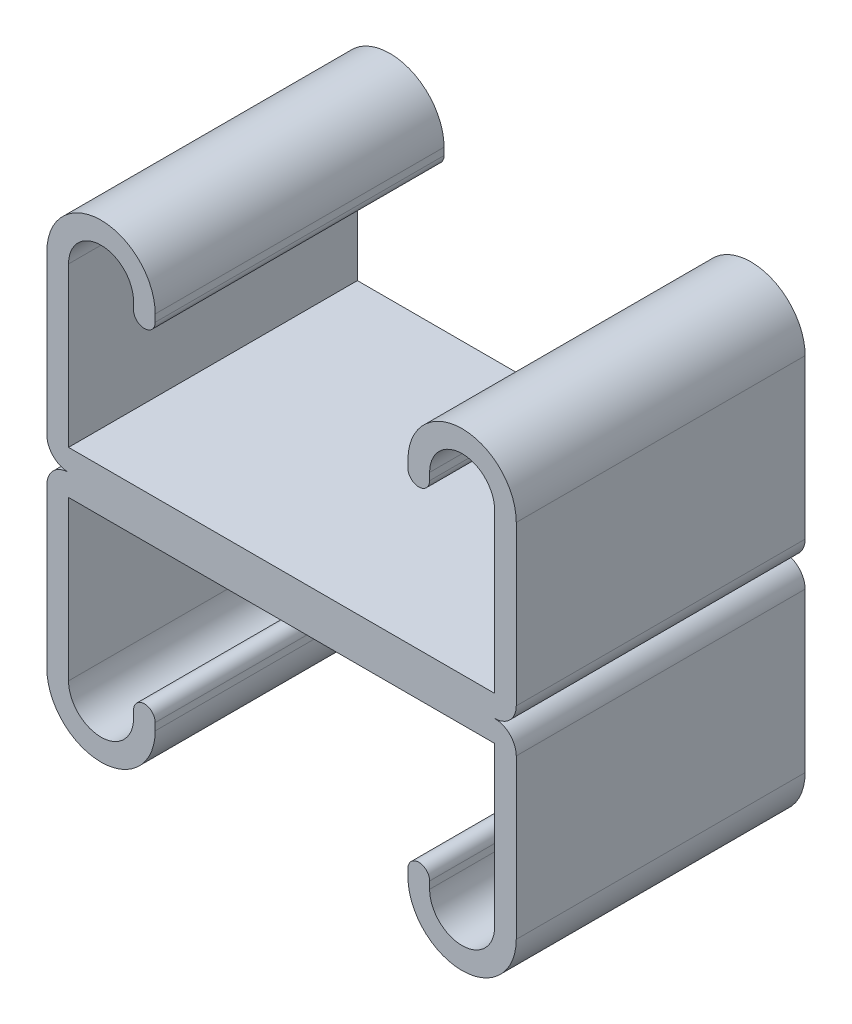
ISO-10303-21;
HEADER;
FILE_DESCRIPTION(('STEP AP214'),'2;1');
FILE_NAME('part.step','',(''),(''),'','','');
FILE_SCHEMA(('AUTOMOTIVE_DESIGN { 1 0 10303 214 1 1 1 1 }'));
ENDSEC;
DATA;
#1=APPLICATION_CONTEXT('core data for automotive mechanical design processes');
#2=APPLICATION_PROTOCOL_DEFINITION('international standard','automotive_design',2000,#1);
#3=PRODUCT_CONTEXT('',#1,'mechanical');
#4=PRODUCT('Part','Part','',(#3));
#5=PRODUCT_RELATED_PRODUCT_CATEGORY('part','',(#4));
#6=PRODUCT_DEFINITION_FORMATION('','',#4);
#7=PRODUCT_DEFINITION_CONTEXT('part definition',#1,'design');
#8=PRODUCT_DEFINITION('design','',#6,#7);
#9=PRODUCT_DEFINITION_SHAPE('','',#8);
#10=(LENGTH_UNIT() NAMED_UNIT(*) SI_UNIT(.MILLI.,.METRE.));
#11=(NAMED_UNIT(*) PLANE_ANGLE_UNIT() SI_UNIT($,.RADIAN.));
#12=(NAMED_UNIT(*) SI_UNIT($,.STERADIAN.) SOLID_ANGLE_UNIT());
#13=UNCERTAINTY_MEASURE_WITH_UNIT(LENGTH_MEASURE(1.E-05),#10,'distance_accuracy_value','');
#14=(GEOMETRIC_REPRESENTATION_CONTEXT(3) GLOBAL_UNCERTAINTY_ASSIGNED_CONTEXT((#13)) GLOBAL_UNIT_ASSIGNED_CONTEXT((#10,
#11,#12)) REPRESENTATION_CONTEXT('',''));
#15=CARTESIAN_POINT('',(0.,0.,0.));
#16=DIRECTION('',(0.,0.,1.));
#17=DIRECTION('',(1.,0.,0.));
#18=AXIS2_PLACEMENT_3D('',#15,#16,#17);
#19=CARTESIAN_POINT('',(-15.875,15.875,12.7));
#20=DIRECTION('',(0.,0.,-1.));
#21=DIRECTION('',(-1.,0.,0.));
#22=AXIS2_PLACEMENT_3D('',#19,#20,#21);
#23=CYLINDRICAL_SURFACE('',#22,4.7625);
#24=CARTESIAN_POINT('',(-15.875,15.875,-12.7));
#25=DIRECTION('',(0.,0.,1.));
#26=DIRECTION('',(-1.,0.,0.));
#27=AXIS2_PLACEMENT_3D('',#24,#25,#26);
#28=CIRCLE('',#27,4.7625);
#29=CARTESIAN_POINT('',(-11.1125,15.875,-12.7));
#30=VERTEX_POINT('',#29);
#31=CARTESIAN_POINT('',(-20.6375,15.875,-12.7));
#32=VERTEX_POINT('',#31);
#33=EDGE_CURVE('E189',#30,#32,#28,.T.);
#34=ORIENTED_EDGE('',*,*,#33,.T.);
#35=DIRECTION('',(0.,0.,-1.));
#36=VECTOR('',#35,1.);
#37=CARTESIAN_POINT('',(-20.6375,15.875,12.7));
#38=LINE('',#37,#36);
#39=CARTESIAN_POINT('',(-20.6375,15.875,12.7));
#40=VERTEX_POINT('',#39);
#41=EDGE_CURVE('E11',#40,#32,#38,.T.);
#42=ORIENTED_EDGE('',*,*,#41,.F.);
#43=CARTESIAN_POINT('',(-15.875,15.875,12.7));
#44=DIRECTION('',(0.,0.,1.));
#45=DIRECTION('',(-1.,0.,0.));
#46=AXIS2_PLACEMENT_3D('',#43,#44,#45);
#47=CIRCLE('',#46,4.7625);
#48=CARTESIAN_POINT('',(-11.1125,15.875,12.7));
#49=VERTEX_POINT('',#48);
#50=EDGE_CURVE('E222',#49,#40,#47,.T.);
#51=ORIENTED_EDGE('',*,*,#50,.F.);
#52=DIRECTION('',(0.,0.,-1.));
#53=VECTOR('',#52,1.);
#54=CARTESIAN_POINT('',(-11.1125,15.875,12.7));
#55=LINE('',#54,#53);
#56=EDGE_CURVE('E185',#49,#30,#55,.T.);
#57=ORIENTED_EDGE('',*,*,#56,.T.);
#58=EDGE_LOOP('',(#34,#42,#51,#57));
#59=FACE_BOUND('',#58,.T.);
#60=ADVANCED_FACE('F32',(#59),#23,.T.);
#61=CARTESIAN_POINT('',(-20.6375,15.875,12.7));
#62=DIRECTION('',(1.,0.,0.));
#63=DIRECTION('',(0.,1.,0.));
#64=AXIS2_PLACEMENT_3D('',#61,#62,#63);
#65=PLANE('',#64);
#66=DIRECTION('',(0.,-1.,0.));
#67=VECTOR('',#66,1.);
#68=CARTESIAN_POINT('',(-20.6375,15.875,-12.7));
#69=LINE('',#68,#67);
#70=CARTESIAN_POINT('',(-20.6375,1.905,-12.7));
#71=VERTEX_POINT('',#70);
#72=EDGE_CURVE('E192',#32,#71,#69,.T.);
#73=ORIENTED_EDGE('',*,*,#72,.T.);
#74=DIRECTION('',(0.,0.,-1.));
#75=VECTOR('',#74,1.);
#76=CARTESIAN_POINT('',(-20.6375,1.905,12.7));
#77=LINE('',#76,#75);
#78=CARTESIAN_POINT('',(-20.6375,1.905,12.7));
#79=VERTEX_POINT('',#78);
#80=EDGE_CURVE('E40',#79,#71,#77,.T.);
#81=ORIENTED_EDGE('',*,*,#80,.F.);
#82=DIRECTION('',(0.,-1.,0.));
#83=VECTOR('',#82,1.);
#84=CARTESIAN_POINT('',(-20.6375,15.875,12.7));
#85=LINE('',#84,#83);
#86=EDGE_CURVE('E119',#40,#79,#85,.T.);
#87=ORIENTED_EDGE('',*,*,#86,.F.);
#88=ORIENTED_EDGE('',*,*,#41,.T.);
#89=EDGE_LOOP('',(#73,#81,#87,#88));
#90=FACE_BOUND('',#89,.T.);
#91=ADVANCED_FACE('F384',(#90),#65,.F.);
#92=CARTESIAN_POINT('',(-18.7325,1.905,12.7));
#93=DIRECTION('',(0.,0.,-1.));
#94=DIRECTION('',(-1.,0.,0.));
#95=AXIS2_PLACEMENT_3D('',#92,#93,#94);
#96=CYLINDRICAL_SURFACE('',#95,1.905);
#97=CARTESIAN_POINT('',(-18.7325,1.905,-12.7));
#98=DIRECTION('',(0.,0.,1.));
#99=DIRECTION('',(-1.,0.,0.));
#100=AXIS2_PLACEMENT_3D('',#97,#98,#99);
#101=CIRCLE('',#100,1.905);
#102=CARTESIAN_POINT('',(-18.7325,0.,-12.7));
#103=VERTEX_POINT('',#102);
#104=EDGE_CURVE('E195',#71,#103,#101,.T.);
#105=ORIENTED_EDGE('',*,*,#104,.T.);
#106=DIRECTION('',(0.,0.,-1.));
#107=VECTOR('',#106,1.);
#108=CARTESIAN_POINT('',(-18.7325,0.,12.7));
#109=LINE('',#108,#107);
#110=CARTESIAN_POINT('',(-18.7325,0.,12.7));
#111=VERTEX_POINT('',#110);
#112=EDGE_CURVE('E259',#111,#103,#109,.T.);
#113=ORIENTED_EDGE('',*,*,#112,.F.);
#114=CARTESIAN_POINT('',(-18.7325,1.905,12.7));
#115=DIRECTION('',(0.,0.,1.));
#116=DIRECTION('',(-1.,0.,0.));
#117=AXIS2_PLACEMENT_3D('',#114,#115,#116);
#118=CIRCLE('',#117,1.905);
#119=EDGE_CURVE('E267',#79,#111,#118,.T.);
#120=ORIENTED_EDGE('',*,*,#119,.F.);
#121=ORIENTED_EDGE('',*,*,#80,.T.);
#122=EDGE_LOOP('',(#105,#113,#120,#121));
#123=FACE_BOUND('',#122,.T.);
#124=ADVANCED_FACE('F265',(#123),#96,.T.);
#125=CARTESIAN_POINT('',(18.7325,1.90500000000001,12.7));
#126=DIRECTION('',(0.,0.,-1.));
#127=DIRECTION('',(-1.,0.,0.));
#128=AXIS2_PLACEMENT_3D('',#125,#126,#127);
#129=CYLINDRICAL_SURFACE('',#128,1.905);
#130=CARTESIAN_POINT('',(18.7325,1.90500000000001,-12.7));
#131=DIRECTION('',(0.,0.,1.));
#132=DIRECTION('',(1.,0.,0.));
#133=AXIS2_PLACEMENT_3D('',#130,#131,#132);
#134=CIRCLE('',#133,1.905);
#135=CARTESIAN_POINT('',(18.7325,0.,-12.7));
#136=VERTEX_POINT('',#135);
#137=CARTESIAN_POINT('',(20.6375,1.90500000000001,-12.7));
#138=VERTEX_POINT('',#137);
#139=EDGE_CURVE('E197',#136,#138,#134,.T.);
#140=ORIENTED_EDGE('',*,*,#139,.T.);
#141=DIRECTION('',(0.,0.,-1.));
#142=VECTOR('',#141,1.);
#143=CARTESIAN_POINT('',(20.6375,1.90500000000001,12.7));
#144=LINE('',#143,#142);
#145=CARTESIAN_POINT('',(20.6375,1.90500000000001,12.7));
#146=VERTEX_POINT('',#145);
#147=EDGE_CURVE('E253',#146,#138,#144,.T.);
#148=ORIENTED_EDGE('',*,*,#147,.F.);
#149=CARTESIAN_POINT('',(18.7325,1.90500000000001,12.7));
#150=DIRECTION('',(0.,0.,1.));
#151=DIRECTION('',(1.,0.,0.));
#152=AXIS2_PLACEMENT_3D('',#149,#150,#151);
#153=CIRCLE('',#152,1.905);
#154=CARTESIAN_POINT('',(18.7325,0.,12.7));
#155=VERTEX_POINT('',#154);
#156=EDGE_CURVE('E341',#155,#146,#153,.T.);
#157=ORIENTED_EDGE('',*,*,#156,.F.);
#158=DIRECTION('',(0.,0.,-1.));
#159=VECTOR('',#158,1.);
#160=CARTESIAN_POINT('',(18.7325,0.,12.7));
#161=LINE('',#160,#159);
#162=EDGE_CURVE('E256',#155,#136,#161,.T.);
#163=ORIENTED_EDGE('',*,*,#162,.T.);
#164=EDGE_LOOP('',(#140,#148,#157,#163));
#165=FACE_BOUND('',#164,.T.);
#166=ADVANCED_FACE('F391',(#165),#129,.T.);
#167=CARTESIAN_POINT('',(20.6375,1.90500000000001,12.7));
#168=DIRECTION('',(-1.,0.,0.));
#169=DIRECTION('',(0.,0.,1.));
#170=AXIS2_PLACEMENT_3D('',#167,#168,#169);
#171=PLANE('',#170);
#172=DIRECTION('',(0.,1.,0.));
#173=VECTOR('',#172,1.);
#174=CARTESIAN_POINT('',(20.6375,1.90500000000001,-12.7));
#175=LINE('',#174,#173);
#176=CARTESIAN_POINT('',(20.6375,15.875,-12.7));
#177=VERTEX_POINT('',#176);
#178=EDGE_CURVE('E199',#138,#177,#175,.T.);
#179=ORIENTED_EDGE('',*,*,#178,.T.);
#180=DIRECTION('',(0.,0.,-1.));
#181=VECTOR('',#180,1.);
#182=CARTESIAN_POINT('',(20.6375,15.875,12.7));
#183=LINE('',#182,#181);
#184=CARTESIAN_POINT('',(20.6375,15.875,12.7));
#185=VERTEX_POINT('',#184);
#186=EDGE_CURVE('E250',#185,#177,#183,.T.);
#187=ORIENTED_EDGE('',*,*,#186,.F.);
#188=DIRECTION('',(0.,1.,0.));
#189=VECTOR('',#188,1.);
#190=CARTESIAN_POINT('',(20.6375,1.90500000000001,12.7));
#191=LINE('',#190,#189);
#192=EDGE_CURVE('E343',#146,#185,#191,.T.);
#193=ORIENTED_EDGE('',*,*,#192,.F.);
#194=ORIENTED_EDGE('',*,*,#147,.T.);
#195=EDGE_LOOP('',(#179,#187,#193,#194));
#196=FACE_BOUND('',#195,.T.);
#197=ADVANCED_FACE('F396',(#196),#171,.F.);
#198=CARTESIAN_POINT('',(15.875,15.875,12.7));
#199=DIRECTION('',(0.,0.,-1.));
#200=DIRECTION('',(-1.,0.,0.));
#201=AXIS2_PLACEMENT_3D('',#198,#199,#200);
#202=CYLINDRICAL_SURFACE('',#201,4.7625);
#203=CARTESIAN_POINT('',(15.875,15.875,-12.7));
#204=DIRECTION('',(0.,0.,1.));
#205=DIRECTION('',(1.,0.,0.));
#206=AXIS2_PLACEMENT_3D('',#203,#204,#205);
#207=CIRCLE('',#206,4.7625);
#208=CARTESIAN_POINT('',(11.1125,15.875,-12.7));
#209=VERTEX_POINT('',#208);
#210=EDGE_CURVE('E201',#177,#209,#207,.T.);
#211=ORIENTED_EDGE('',*,*,#210,.T.);
#212=DIRECTION('',(0.,0.,-1.));
#213=VECTOR('',#212,1.);
#214=CARTESIAN_POINT('',(11.1125,15.875,12.7));
#215=LINE('',#214,#213);
#216=CARTESIAN_POINT('',(11.1125,15.875,12.7));
#217=VERTEX_POINT('',#216);
#218=EDGE_CURVE('E247',#217,#209,#215,.T.);
#219=ORIENTED_EDGE('',*,*,#218,.F.);
#220=CARTESIAN_POINT('',(15.875,15.875,12.7));
#221=DIRECTION('',(0.,0.,1.));
#222=DIRECTION('',(1.,0.,0.));
#223=AXIS2_PLACEMENT_3D('',#220,#221,#222);
#224=CIRCLE('',#223,4.7625);
#225=EDGE_CURVE('E345',#185,#217,#224,.T.);
#226=ORIENTED_EDGE('',*,*,#225,.F.);
#227=ORIENTED_EDGE('',*,*,#186,.T.);
#228=EDGE_LOOP('',(#211,#219,#226,#227));
#229=FACE_BOUND('',#228,.T.);
#230=ADVANCED_FACE('F400',(#229),#202,.T.);
#231=CARTESIAN_POINT('',(11.1125,15.875,12.7));
#232=DIRECTION('',(1.,0.,0.));
#233=DIRECTION('',(0.,1.,0.));
#234=AXIS2_PLACEMENT_3D('',#231,#232,#233);
#235=PLANE('',#234);
#236=DIRECTION('',(0.,-1.,0.));
#237=VECTOR('',#236,1.);
#238=CARTESIAN_POINT('',(11.1125,15.875,-12.7));
#239=LINE('',#238,#237);
#240=CARTESIAN_POINT('',(11.1125,15.24,-12.7));
#241=VERTEX_POINT('',#240);
#242=EDGE_CURVE('E203',#209,#241,#239,.T.);
#243=ORIENTED_EDGE('',*,*,#242,.T.);
#244=DIRECTION('',(0.,0.,-1.));
#245=VECTOR('',#244,1.);
#246=CARTESIAN_POINT('',(11.1125,15.24,12.7));
#247=LINE('',#246,#245);
#248=CARTESIAN_POINT('',(11.1125,15.24,12.7));
#249=VERTEX_POINT('',#248);
#250=EDGE_CURVE('E244',#249,#241,#247,.T.);
#251=ORIENTED_EDGE('',*,*,#250,.F.);
#252=DIRECTION('',(0.,-1.,0.));
#253=VECTOR('',#252,1.);
#254=CARTESIAN_POINT('',(11.1125,15.875,12.7));
#255=LINE('',#254,#253);
#256=EDGE_CURVE('E347',#217,#249,#255,.T.);
#257=ORIENTED_EDGE('',*,*,#256,.F.);
#258=ORIENTED_EDGE('',*,*,#218,.T.);
#259=EDGE_LOOP('',(#243,#251,#257,#258));
#260=FACE_BOUND('',#259,.T.);
#261=ADVANCED_FACE('F404',(#260),#235,.F.);
#262=CARTESIAN_POINT('',(12.065,15.24,12.7));
#263=DIRECTION('',(0.,0.,-1.));
#264=DIRECTION('',(-1.,0.,0.));
#265=AXIS2_PLACEMENT_3D('',#262,#263,#264);
#266=CYLINDRICAL_SURFACE('',#265,0.952500000000002);
#267=CARTESIAN_POINT('',(12.065,15.24,-12.7));
#268=DIRECTION('',(0.,0.,1.));
#269=DIRECTION('',(1.,0.,0.));
#270=AXIS2_PLACEMENT_3D('',#267,#268,#269);
#271=CIRCLE('',#270,0.952500000000002);
#272=CARTESIAN_POINT('',(13.0175,15.24,-12.7));
#273=VERTEX_POINT('',#272);
#274=EDGE_CURVE('E205',#241,#273,#271,.T.);
#275=ORIENTED_EDGE('',*,*,#274,.T.);
#276=DIRECTION('',(0.,0.,-1.));
#277=VECTOR('',#276,1.);
#278=CARTESIAN_POINT('',(13.0175,15.24,12.7));
#279=LINE('',#278,#277);
#280=CARTESIAN_POINT('',(13.0175,15.24,12.7));
#281=VERTEX_POINT('',#280);
#282=EDGE_CURVE('E241',#281,#273,#279,.T.);
#283=ORIENTED_EDGE('',*,*,#282,.F.);
#284=CARTESIAN_POINT('',(12.065,15.24,12.7));
#285=DIRECTION('',(0.,0.,1.));
#286=DIRECTION('',(1.,0.,0.));
#287=AXIS2_PLACEMENT_3D('',#284,#285,#286);
#288=CIRCLE('',#287,0.952500000000002);
#289=EDGE_CURVE('E349',#249,#281,#288,.T.);
#290=ORIENTED_EDGE('',*,*,#289,.F.);
#291=ORIENTED_EDGE('',*,*,#250,.T.);
#292=EDGE_LOOP('',(#275,#283,#290,#291));
#293=FACE_BOUND('',#292,.T.);
#294=ADVANCED_FACE('F408',(#293),#266,.T.);
#295=CARTESIAN_POINT('',(13.0175,15.875,12.7));
#296=DIRECTION('',(-1.,0.,0.));
#297=DIRECTION('',(0.,-1.,0.));
#298=AXIS2_PLACEMENT_3D('',#295,#296,#297);
#299=PLANE('',#298);
#300=DIRECTION('',(0.,1.,0.));
#301=VECTOR('',#300,1.);
#302=CARTESIAN_POINT('',(13.0175,15.875,-12.7));
#303=LINE('',#302,#301);
#304=CARTESIAN_POINT('',(13.0175,15.875,-12.7));
#305=VERTEX_POINT('',#304);
#306=EDGE_CURVE('E207',#273,#305,#303,.T.);
#307=ORIENTED_EDGE('',*,*,#306,.T.);
#308=DIRECTION('',(0.,0.,-1.));
#309=VECTOR('',#308,1.);
#310=CARTESIAN_POINT('',(13.0175,15.875,12.7));
#311=LINE('',#310,#309);
#312=CARTESIAN_POINT('',(13.0175,15.875,12.7));
#313=VERTEX_POINT('',#312);
#314=EDGE_CURVE('E238',#313,#305,#311,.T.);
#315=ORIENTED_EDGE('',*,*,#314,.F.);
#316=DIRECTION('',(0.,1.,0.));
#317=VECTOR('',#316,1.);
#318=CARTESIAN_POINT('',(13.0175,15.875,12.7));
#319=LINE('',#318,#317);
#320=EDGE_CURVE('E351',#281,#313,#319,.T.);
#321=ORIENTED_EDGE('',*,*,#320,.F.);
#322=ORIENTED_EDGE('',*,*,#282,.T.);
#323=EDGE_LOOP('',(#307,#315,#321,#322));
#324=FACE_BOUND('',#323,.T.);
#325=ADVANCED_FACE('F412',(#324),#299,.F.);
#326=CARTESIAN_POINT('',(15.875,15.875,12.7));
#327=DIRECTION('',(0.,0.,-1.));
#328=DIRECTION('',(-1.,0.,0.));
#329=AXIS2_PLACEMENT_3D('',#326,#327,#328);
#330=CYLINDRICAL_SURFACE('',#329,2.8575);
#331=CARTESIAN_POINT('',(15.875,15.875,-12.7));
#332=DIRECTION('',(0.,0.,-1.));
#333=DIRECTION('',(1.,0.,0.));
#334=AXIS2_PLACEMENT_3D('',#331,#332,#333);
#335=CIRCLE('',#334,2.8575);
#336=CARTESIAN_POINT('',(18.7325,15.875,-12.7));
#337=VERTEX_POINT('',#336);
#338=EDGE_CURVE('E209',#305,#337,#335,.T.);
#339=ORIENTED_EDGE('',*,*,#338,.T.);
#340=DIRECTION('',(0.,0.,-1.));
#341=VECTOR('',#340,1.);
#342=CARTESIAN_POINT('',(18.7325,15.875,12.7));
#343=LINE('',#342,#341);
#344=CARTESIAN_POINT('',(18.7325,15.875,12.7));
#345=VERTEX_POINT('',#344);
#346=EDGE_CURVE('E235',#345,#337,#343,.T.);
#347=ORIENTED_EDGE('',*,*,#346,.F.);
#348=CARTESIAN_POINT('',(15.875,15.875,12.7));
#349=DIRECTION('',(0.,0.,-1.));
#350=DIRECTION('',(1.,0.,0.));
#351=AXIS2_PLACEMENT_3D('',#348,#349,#350);
#352=CIRCLE('',#351,2.8575);
#353=EDGE_CURVE('E353',#313,#345,#352,.T.);
#354=ORIENTED_EDGE('',*,*,#353,.F.);
#355=ORIENTED_EDGE('',*,*,#314,.T.);
#356=EDGE_LOOP('',(#339,#347,#354,#355));
#357=FACE_BOUND('',#356,.T.);
#358=ADVANCED_FACE('F416',(#357),#330,.F.);
#359=CARTESIAN_POINT('',(18.7325,1.905,12.7));
#360=DIRECTION('',(1.,0.,0.));
#361=DIRECTION('',(0.,1.,0.));
#362=AXIS2_PLACEMENT_3D('',#359,#360,#361);
#363=PLANE('',#362);
#364=DIRECTION('',(0.,-1.,0.));
#365=VECTOR('',#364,1.);
#366=CARTESIAN_POINT('',(18.7325,1.905,-12.7));
#367=LINE('',#366,#365);
#368=CARTESIAN_POINT('',(18.7325,1.905,-12.7));
#369=VERTEX_POINT('',#368);
#370=EDGE_CURVE('E211',#337,#369,#367,.T.);
#371=ORIENTED_EDGE('',*,*,#370,.T.);
#372=DIRECTION('',(0.,0.,-1.));
#373=VECTOR('',#372,1.);
#374=CARTESIAN_POINT('',(18.7325,1.905,12.7));
#375=LINE('',#374,#373);
#376=CARTESIAN_POINT('',(18.7325,1.905,12.7));
#377=VERTEX_POINT('',#376);
#378=EDGE_CURVE('E232',#377,#369,#375,.T.);
#379=ORIENTED_EDGE('',*,*,#378,.F.);
#380=DIRECTION('',(0.,-1.,0.));
#381=VECTOR('',#380,1.);
#382=CARTESIAN_POINT('',(18.7325,1.905,12.7));
#383=LINE('',#382,#381);
#384=EDGE_CURVE('E355',#345,#377,#383,.T.);
#385=ORIENTED_EDGE('',*,*,#384,.F.);
#386=ORIENTED_EDGE('',*,*,#346,.T.);
#387=EDGE_LOOP('',(#371,#379,#385,#386));
#388=FACE_BOUND('',#387,.T.);
#389=ADVANCED_FACE('F420',(#388),#363,.F.);
#390=CARTESIAN_POINT('',(-18.7325,1.905,12.7));
#391=DIRECTION('',(0.,-1.,0.));
#392=DIRECTION('',(1.,0.,0.));
#393=AXIS2_PLACEMENT_3D('',#390,#391,#392);
#394=PLANE('',#393);
#395=DIRECTION('',(-1.,0.,0.));
#396=VECTOR('',#395,1.);
#397=CARTESIAN_POINT('',(-18.7325,1.905,-12.7));
#398=LINE('',#397,#396);
#399=CARTESIAN_POINT('',(-18.7325,1.905,-12.7));
#400=VERTEX_POINT('',#399);
#401=EDGE_CURVE('E213',#369,#400,#398,.T.);
#402=ORIENTED_EDGE('',*,*,#401,.T.);
#403=DIRECTION('',(0.,0.,-1.));
#404=VECTOR('',#403,1.);
#405=CARTESIAN_POINT('',(-18.7325,1.905,12.7));
#406=LINE('',#405,#404);
#407=CARTESIAN_POINT('',(-18.7325,1.905,12.7));
#408=VERTEX_POINT('',#407);
#409=EDGE_CURVE('E229',#408,#400,#406,.T.);
#410=ORIENTED_EDGE('',*,*,#409,.F.);
#411=DIRECTION('',(-1.,0.,0.));
#412=VECTOR('',#411,1.);
#413=CARTESIAN_POINT('',(-18.7325,1.905,12.7));
#414=LINE('',#413,#412);
#415=EDGE_CURVE('E357',#377,#408,#414,.T.);
#416=ORIENTED_EDGE('',*,*,#415,.F.);
#417=ORIENTED_EDGE('',*,*,#378,.T.);
#418=EDGE_LOOP('',(#402,#410,#416,#417));
#419=FACE_BOUND('',#418,.T.);
#420=ADVANCED_FACE('F424',(#419),#394,.F.);
#421=CARTESIAN_POINT('',(-18.7325,15.875,12.7));
#422=DIRECTION('',(-1.,0.,0.));
#423=DIRECTION('',(0.,-1.,0.));
#424=AXIS2_PLACEMENT_3D('',#421,#422,#423);
#425=PLANE('',#424);
#426=DIRECTION('',(0.,1.,0.));
#427=VECTOR('',#426,1.);
#428=CARTESIAN_POINT('',(-18.7325,15.875,-12.7));
#429=LINE('',#428,#427);
#430=CARTESIAN_POINT('',(-18.7325,15.875,-12.7));
#431=VERTEX_POINT('',#430);
#432=EDGE_CURVE('E215',#400,#431,#429,.T.);
#433=ORIENTED_EDGE('',*,*,#432,.T.);
#434=DIRECTION('',(0.,0.,-1.));
#435=VECTOR('',#434,1.);
#436=CARTESIAN_POINT('',(-18.7325,15.875,12.7));
#437=LINE('',#436,#435);
#438=CARTESIAN_POINT('',(-18.7325,15.875,12.7));
#439=VERTEX_POINT('',#438);
#440=EDGE_CURVE('E226',#439,#431,#437,.T.);
#441=ORIENTED_EDGE('',*,*,#440,.F.);
#442=DIRECTION('',(0.,1.,0.));
#443=VECTOR('',#442,1.);
#444=CARTESIAN_POINT('',(-18.7325,15.875,12.7));
#445=LINE('',#444,#443);
#446=EDGE_CURVE('E359',#408,#439,#445,.T.);
#447=ORIENTED_EDGE('',*,*,#446,.F.);
#448=ORIENTED_EDGE('',*,*,#409,.T.);
#449=EDGE_LOOP('',(#433,#441,#447,#448));
#450=FACE_BOUND('',#449,.T.);
#451=ADVANCED_FACE('F365',(#450),#425,.F.);
#452=CARTESIAN_POINT('',(-15.875,15.875,12.7));
#453=DIRECTION('',(0.,0.,-1.));
#454=DIRECTION('',(-1.,0.,0.));
#455=AXIS2_PLACEMENT_3D('',#452,#453,#454);
#456=CYLINDRICAL_SURFACE('',#455,2.8575);
#457=CARTESIAN_POINT('',(-15.875,15.875,-12.7));
#458=DIRECTION('',(0.,0.,-1.));
#459=DIRECTION('',(-1.,0.,0.));
#460=AXIS2_PLACEMENT_3D('',#457,#458,#459);
#461=CIRCLE('',#460,2.8575);
#462=CARTESIAN_POINT('',(-13.0175,15.875,-12.7));
#463=VERTEX_POINT('',#462);
#464=EDGE_CURVE('E217',#431,#463,#461,.T.);
#465=ORIENTED_EDGE('',*,*,#464,.T.);
#466=DIRECTION('',(0.,0.,-1.));
#467=VECTOR('',#466,1.);
#468=CARTESIAN_POINT('',(-13.0175,15.875,12.7));
#469=LINE('',#468,#467);
#470=CARTESIAN_POINT('',(-13.0175,15.875,12.7));
#471=VERTEX_POINT('',#470);
#472=EDGE_CURVE('E180',#471,#463,#469,.T.);
#473=ORIENTED_EDGE('',*,*,#472,.F.);
#474=CARTESIAN_POINT('',(-15.875,15.875,12.7));
#475=DIRECTION('',(0.,0.,-1.));
#476=DIRECTION('',(-1.,0.,0.));
#477=AXIS2_PLACEMENT_3D('',#474,#475,#476);
#478=CIRCLE('',#477,2.8575);
#479=EDGE_CURVE('E171',#439,#471,#478,.T.);
#480=ORIENTED_EDGE('',*,*,#479,.F.);
#481=ORIENTED_EDGE('',*,*,#440,.T.);
#482=EDGE_LOOP('',(#465,#473,#480,#481));
#483=FACE_BOUND('',#482,.T.);
#484=ADVANCED_FACE('F369',(#483),#456,.F.);
#485=CARTESIAN_POINT('',(-13.0175,15.875,12.7));
#486=DIRECTION('',(1.,0.,0.));
#487=DIRECTION('',(0.,1.,0.));
#488=AXIS2_PLACEMENT_3D('',#485,#486,#487);
#489=PLANE('',#488);
#490=DIRECTION('',(0.,-1.,0.));
#491=VECTOR('',#490,1.);
#492=CARTESIAN_POINT('',(-13.0175,15.875,-12.7));
#493=LINE('',#492,#491);
#494=CARTESIAN_POINT('',(-13.0175,15.24,-12.7));
#495=VERTEX_POINT('',#494);
#496=EDGE_CURVE('E179',#463,#495,#493,.T.);
#497=ORIENTED_EDGE('',*,*,#496,.T.);
#498=DIRECTION('',(0.,0.,-1.));
#499=VECTOR('',#498,1.);
#500=CARTESIAN_POINT('',(-13.0175,15.24,12.7));
#501=LINE('',#500,#499);
#502=CARTESIAN_POINT('',(-13.0175,15.24,12.7));
#503=VERTEX_POINT('',#502);
#504=EDGE_CURVE('E176',#503,#495,#501,.T.);
#505=ORIENTED_EDGE('',*,*,#504,.F.);
#506=DIRECTION('',(0.,-1.,0.));
#507=VECTOR('',#506,1.);
#508=CARTESIAN_POINT('',(-13.0175,15.875,12.7));
#509=LINE('',#508,#507);
#510=EDGE_CURVE('E165',#471,#503,#509,.T.);
#511=ORIENTED_EDGE('',*,*,#510,.F.);
#512=ORIENTED_EDGE('',*,*,#472,.T.);
#513=EDGE_LOOP('',(#497,#505,#511,#512));
#514=FACE_BOUND('',#513,.T.);
#515=ADVANCED_FACE('F177',(#514),#489,.F.);
#516=CARTESIAN_POINT('',(-12.065,15.24,12.7));
#517=DIRECTION('',(0.,0.,-1.));
#518=DIRECTION('',(-1.,0.,0.));
#519=AXIS2_PLACEMENT_3D('',#516,#517,#518);
#520=CYLINDRICAL_SURFACE('',#519,0.952500000000002);
#521=CARTESIAN_POINT('',(-12.065,15.24,-12.7));
#522=DIRECTION('',(0.,0.,1.));
#523=DIRECTION('',(-1.,0.,0.));
#524=AXIS2_PLACEMENT_3D('',#521,#522,#523);
#525=CIRCLE('',#524,0.952500000000002);
#526=CARTESIAN_POINT('',(-11.1125,15.24,-12.7));
#527=VERTEX_POINT('',#526);
#528=EDGE_CURVE('E105',#495,#527,#525,.T.);
#529=ORIENTED_EDGE('',*,*,#528,.T.);
#530=DIRECTION('',(0.,0.,-1.));
#531=VECTOR('',#530,1.);
#532=CARTESIAN_POINT('',(-11.1125,15.24,12.7));
#533=LINE('',#532,#531);
#534=CARTESIAN_POINT('',(-11.1125,15.24,12.7));
#535=VERTEX_POINT('',#534);
#536=EDGE_CURVE('E181',#535,#527,#533,.T.);
#537=ORIENTED_EDGE('',*,*,#536,.F.);
#538=CARTESIAN_POINT('',(-12.065,15.24,12.7));
#539=DIRECTION('',(0.,0.,1.));
#540=DIRECTION('',(-1.,0.,0.));
#541=AXIS2_PLACEMENT_3D('',#538,#539,#540);
#542=CIRCLE('',#541,0.952500000000002);
#543=EDGE_CURVE('E169',#503,#535,#542,.T.);
#544=ORIENTED_EDGE('',*,*,#543,.F.);
#545=ORIENTED_EDGE('',*,*,#504,.T.);
#546=EDGE_LOOP('',(#529,#537,#544,#545));
#547=FACE_BOUND('',#546,.T.);
#548=ADVANCED_FACE('F183',(#547),#520,.T.);
#549=CARTESIAN_POINT('',(-11.1125,15.875,12.7));
#550=DIRECTION('',(-1.,0.,0.));
#551=DIRECTION('',(0.,-1.,0.));
#552=AXIS2_PLACEMENT_3D('',#549,#550,#551);
#553=PLANE('',#552);
#554=DIRECTION('',(0.,1.,0.));
#555=VECTOR('',#554,1.);
#556=CARTESIAN_POINT('',(-11.1125,15.875,-12.7));
#557=LINE('',#556,#555);
#558=EDGE_CURVE('E111',#527,#30,#557,.T.);
#559=ORIENTED_EDGE('',*,*,#558,.T.);
#560=ORIENTED_EDGE('',*,*,#56,.F.);
#561=DIRECTION('',(0.,1.,0.));
#562=VECTOR('',#561,1.);
#563=CARTESIAN_POINT('',(-11.1125,15.875,12.7));
#564=LINE('',#563,#562);
#565=EDGE_CURVE('E48',#535,#49,#564,.T.);
#566=ORIENTED_EDGE('',*,*,#565,.F.);
#567=ORIENTED_EDGE('',*,*,#536,.T.);
#568=EDGE_LOOP('',(#559,#560,#566,#567));
#569=FACE_BOUND('',#568,.T.);
#570=ADVANCED_FACE('F373',(#569),#553,.F.);
#571=CARTESIAN_POINT('',(-15.875,15.875,12.7));
#572=DIRECTION('',(0.,0.,-1.));
#573=DIRECTION('',(-1.,0.,0.));
#574=AXIS2_PLACEMENT_3D('',#571,#572,#573);
#575=PLANE('',#574);
#576=ORIENTED_EDGE('',*,*,#50,.T.);
#577=ORIENTED_EDGE('',*,*,#86,.T.);
#578=ORIENTED_EDGE('',*,*,#119,.T.);
#579=CARTESIAN_POINT('',(-18.7325,-1.905,12.7));
#580=DIRECTION('',(0.,0.,-1.));
#581=DIRECTION('',(-1.,0.,0.));
#582=AXIS2_PLACEMENT_3D('',#579,#580,#581);
#583=CIRCLE('',#582,1.905);
#584=CARTESIAN_POINT('',(-20.6375,-1.905,12.7));
#585=VERTEX_POINT('',#584);
#586=EDGE_CURVE('E782',#585,#111,#583,.T.);
#587=ORIENTED_EDGE('',*,*,#586,.F.);
#588=DIRECTION('',(0.,1.,0.));
#589=VECTOR('',#588,1.);
#590=CARTESIAN_POINT('',(-20.6375,-15.875,12.7));
#591=LINE('',#590,#589);
#592=CARTESIAN_POINT('',(-20.6375,-15.875,12.7));
#593=VERTEX_POINT('',#592);
#594=EDGE_CURVE('E294',#593,#585,#591,.T.);
#595=ORIENTED_EDGE('',*,*,#594,.F.);
#596=CARTESIAN_POINT('',(-15.875,-15.875,12.7));
#597=DIRECTION('',(0.,0.,-1.));
#598=DIRECTION('',(-1.,0.,0.));
#599=AXIS2_PLACEMENT_3D('',#596,#597,#598);
#600=CIRCLE('',#599,4.7625);
#601=CARTESIAN_POINT('',(-11.1125,-15.875,12.7));
#602=VERTEX_POINT('',#601);
#603=EDGE_CURVE('E283',#602,#593,#600,.T.);
#604=ORIENTED_EDGE('',*,*,#603,.F.);
#605=DIRECTION('',(0.,-1.,0.));
#606=VECTOR('',#605,1.);
#607=CARTESIAN_POINT('',(-11.1125,-15.875,12.7));
#608=LINE('',#607,#606);
#609=CARTESIAN_POINT('',(-11.1125,-15.24,12.7));
#610=VERTEX_POINT('',#609);
#611=EDGE_CURVE('E731',#610,#602,#608,.T.);
#612=ORIENTED_EDGE('',*,*,#611,.F.);
#613=CARTESIAN_POINT('',(-12.065,-15.24,12.7));
#614=DIRECTION('',(0.,0.,-1.));
#615=DIRECTION('',(-1.,0.,0.));
#616=AXIS2_PLACEMENT_3D('',#613,#614,#615);
#617=CIRCLE('',#616,0.952500000000002);
#618=CARTESIAN_POINT('',(-13.0175,-15.24,12.7));
#619=VERTEX_POINT('',#618);
#620=EDGE_CURVE('E740',#619,#610,#617,.T.);
#621=ORIENTED_EDGE('',*,*,#620,.F.);
#622=DIRECTION('',(0.,1.,0.));
#623=VECTOR('',#622,1.);
#624=CARTESIAN_POINT('',(-13.0175,-15.875,12.7));
#625=LINE('',#624,#623);
#626=CARTESIAN_POINT('',(-13.0175,-15.875,12.7));
#627=VERTEX_POINT('',#626);
#628=EDGE_CURVE('E744',#627,#619,#625,.T.);
#629=ORIENTED_EDGE('',*,*,#628,.F.);
#630=CARTESIAN_POINT('',(-15.875,-15.875,12.7));
#631=DIRECTION('',(0.,0.,1.));
#632=DIRECTION('',(-1.,0.,0.));
#633=AXIS2_PLACEMENT_3D('',#630,#631,#632);
#634=CIRCLE('',#633,2.8575);
#635=CARTESIAN_POINT('',(-18.7325,-15.875,12.7));
#636=VERTEX_POINT('',#635);
#637=EDGE_CURVE('E746',#636,#627,#634,.T.);
#638=ORIENTED_EDGE('',*,*,#637,.F.);
#639=DIRECTION('',(0.,-1.,0.));
#640=VECTOR('',#639,1.);
#641=CARTESIAN_POINT('',(-18.7325,-15.875,12.7));
#642=LINE('',#641,#640);
#643=CARTESIAN_POINT('',(-18.7325,-1.905,12.7));
#644=VERTEX_POINT('',#643);
#645=EDGE_CURVE('E752',#644,#636,#642,.T.);
#646=ORIENTED_EDGE('',*,*,#645,.F.);
#647=DIRECTION('',(-1.,0.,0.));
#648=VECTOR('',#647,1.);
#649=CARTESIAN_POINT('',(-18.7325,-1.905,12.7));
#650=LINE('',#649,#648);
#651=CARTESIAN_POINT('',(18.7325,-1.905,12.7));
#652=VERTEX_POINT('',#651);
#653=EDGE_CURVE('E755',#652,#644,#650,.T.);
#654=ORIENTED_EDGE('',*,*,#653,.F.);
#655=DIRECTION('',(0.,1.,0.));
#656=VECTOR('',#655,1.);
#657=CARTESIAN_POINT('',(18.7325,-1.905,12.7));
#658=LINE('',#657,#656);
#659=CARTESIAN_POINT('',(18.7325,-15.875,12.7));
#660=VERTEX_POINT('',#659);
#661=EDGE_CURVE('E758',#660,#652,#658,.T.);
#662=ORIENTED_EDGE('',*,*,#661,.F.);
#663=CARTESIAN_POINT('',(15.875,-15.875,12.7));
#664=DIRECTION('',(0.,0.,1.));
#665=DIRECTION('',(1.,0.,0.));
#666=AXIS2_PLACEMENT_3D('',#663,#664,#665);
#667=CIRCLE('',#666,2.8575);
#668=CARTESIAN_POINT('',(13.0175,-15.875,12.7));
#669=VERTEX_POINT('',#668);
#670=EDGE_CURVE('E761',#669,#660,#667,.T.);
#671=ORIENTED_EDGE('',*,*,#670,.F.);
#672=DIRECTION('',(0.,-1.,0.));
#673=VECTOR('',#672,1.);
#674=CARTESIAN_POINT('',(13.0175,-15.875,12.7));
#675=LINE('',#674,#673);
#676=CARTESIAN_POINT('',(13.0175,-15.24,12.7));
#677=VERTEX_POINT('',#676);
#678=EDGE_CURVE('E764',#677,#669,#675,.T.);
#679=ORIENTED_EDGE('',*,*,#678,.F.);
#680=CARTESIAN_POINT('',(12.065,-15.24,12.7));
#681=DIRECTION('',(0.,0.,-1.));
#682=DIRECTION('',(1.,0.,0.));
#683=AXIS2_PLACEMENT_3D('',#680,#681,#682);
#684=CIRCLE('',#683,0.952500000000002);
#685=CARTESIAN_POINT('',(11.1125,-15.24,12.7));
#686=VERTEX_POINT('',#685);
#687=EDGE_CURVE('E767',#686,#677,#684,.T.);
#688=ORIENTED_EDGE('',*,*,#687,.F.);
#689=DIRECTION('',(0.,1.,0.));
#690=VECTOR('',#689,1.);
#691=CARTESIAN_POINT('',(11.1125,-15.875,12.7));
#692=LINE('',#691,#690);
#693=CARTESIAN_POINT('',(11.1125,-15.875,12.7));
#694=VERTEX_POINT('',#693);
#695=EDGE_CURVE('E770',#694,#686,#692,.T.);
#696=ORIENTED_EDGE('',*,*,#695,.F.);
#697=CARTESIAN_POINT('',(15.875,-15.875,12.7));
#698=DIRECTION('',(0.,0.,-1.));
#699=DIRECTION('',(1.,0.,0.));
#700=AXIS2_PLACEMENT_3D('',#697,#698,#699);
#701=CIRCLE('',#700,4.7625);
#702=CARTESIAN_POINT('',(20.6375,-15.875,12.7));
#703=VERTEX_POINT('',#702);
#704=EDGE_CURVE('E773',#703,#694,#701,.T.);
#705=ORIENTED_EDGE('',*,*,#704,.F.);
#706=DIRECTION('',(0.,-1.,0.));
#707=VECTOR('',#706,1.);
#708=CARTESIAN_POINT('',(20.6375,-1.90500000000001,12.7));
#709=LINE('',#708,#707);
#710=CARTESIAN_POINT('',(20.6375,-1.90500000000001,12.7));
#711=VERTEX_POINT('',#710);
#712=EDGE_CURVE('E776',#711,#703,#709,.T.);
#713=ORIENTED_EDGE('',*,*,#712,.F.);
#714=CARTESIAN_POINT('',(18.7325,-1.90500000000001,12.7));
#715=DIRECTION('',(0.,0.,-1.));
#716=DIRECTION('',(1.,0.,0.));
#717=AXIS2_PLACEMENT_3D('',#714,#715,#716);
#718=CIRCLE('',#717,1.905);
#719=EDGE_CURVE('E779',#155,#711,#718,.T.);
#720=ORIENTED_EDGE('',*,*,#719,.F.);
#721=ORIENTED_EDGE('',*,*,#156,.T.);
#722=ORIENTED_EDGE('',*,*,#192,.T.);
#723=ORIENTED_EDGE('',*,*,#225,.T.);
#724=ORIENTED_EDGE('',*,*,#256,.T.);
#725=ORIENTED_EDGE('',*,*,#289,.T.);
#726=ORIENTED_EDGE('',*,*,#320,.T.);
#727=ORIENTED_EDGE('',*,*,#353,.T.);
#728=ORIENTED_EDGE('',*,*,#384,.T.);
#729=ORIENTED_EDGE('',*,*,#415,.T.);
#730=ORIENTED_EDGE('',*,*,#446,.T.);
#731=ORIENTED_EDGE('',*,*,#479,.T.);
#732=ORIENTED_EDGE('',*,*,#510,.T.);
#733=ORIENTED_EDGE('',*,*,#543,.T.);
#734=ORIENTED_EDGE('',*,*,#565,.T.);
#735=EDGE_LOOP('',(#576,#577,#578,#587,#595,#604,#612,#621,#629,#638,#646,#654,#662,#671,#679,
#688,#696,#705,#713,#720,#721,#722,#723,#724,#725,#726,#727,#728,#729,#730,#731,#732,#733,#734));
#736=FACE_BOUND('',#735,.T.);
#737=ADVANCED_FACE('F167',(#736),#575,.F.);
#738=CARTESIAN_POINT('',(-15.875,15.875,-12.7));
#739=DIRECTION('',(0.,0.,-1.));
#740=DIRECTION('',(-1.,0.,0.));
#741=AXIS2_PLACEMENT_3D('',#738,#739,#740);
#742=PLANE('',#741);
#743=ORIENTED_EDGE('',*,*,#33,.F.);
#744=ORIENTED_EDGE('',*,*,#558,.F.);
#745=ORIENTED_EDGE('',*,*,#528,.F.);
#746=ORIENTED_EDGE('',*,*,#496,.F.);
#747=ORIENTED_EDGE('',*,*,#464,.F.);
#748=ORIENTED_EDGE('',*,*,#432,.F.);
#749=ORIENTED_EDGE('',*,*,#401,.F.);
#750=ORIENTED_EDGE('',*,*,#370,.F.);
#751=ORIENTED_EDGE('',*,*,#338,.F.);
#752=ORIENTED_EDGE('',*,*,#306,.F.);
#753=ORIENTED_EDGE('',*,*,#274,.F.);
#754=ORIENTED_EDGE('',*,*,#242,.F.);
#755=ORIENTED_EDGE('',*,*,#210,.F.);
#756=ORIENTED_EDGE('',*,*,#178,.F.);
#757=ORIENTED_EDGE('',*,*,#139,.F.);
#758=CARTESIAN_POINT('',(18.7325,-1.90500000000001,-12.7));
#759=DIRECTION('',(0.,0.,-1.));
#760=DIRECTION('',(1.,0.,0.));
#761=AXIS2_PLACEMENT_3D('',#758,#759,#760);
#762=CIRCLE('',#761,1.905);
#763=CARTESIAN_POINT('',(20.6375,-1.90500000000001,-12.7));
#764=VERTEX_POINT('',#763);
#765=EDGE_CURVE('E281',#136,#764,#762,.T.);
#766=ORIENTED_EDGE('',*,*,#765,.T.);
#767=DIRECTION('',(0.,-1.,0.));
#768=VECTOR('',#767,1.);
#769=CARTESIAN_POINT('',(20.6375,-1.90500000000001,-12.7));
#770=LINE('',#769,#768);
#771=CARTESIAN_POINT('',(20.6375,-15.875,-12.7));
#772=VERTEX_POINT('',#771);
#773=EDGE_CURVE('E286',#764,#772,#770,.T.);
#774=ORIENTED_EDGE('',*,*,#773,.T.);
#775=CARTESIAN_POINT('',(15.875,-15.875,-12.7));
#776=DIRECTION('',(0.,0.,-1.));
#777=DIRECTION('',(1.,0.,0.));
#778=AXIS2_PLACEMENT_3D('',#775,#776,#777);
#779=CIRCLE('',#778,4.7625);
#780=CARTESIAN_POINT('',(11.1125,-15.875,-12.7));
#781=VERTEX_POINT('',#780);
#782=EDGE_CURVE('E818',#772,#781,#779,.T.);
#783=ORIENTED_EDGE('',*,*,#782,.T.);
#784=DIRECTION('',(0.,1.,0.));
#785=VECTOR('',#784,1.);
#786=CARTESIAN_POINT('',(11.1125,-15.875,-12.7));
#787=LINE('',#786,#785);
#788=CARTESIAN_POINT('',(11.1125,-15.24,-12.7));
#789=VERTEX_POINT('',#788);
#790=EDGE_CURVE('E815',#781,#789,#787,.T.);
#791=ORIENTED_EDGE('',*,*,#790,.T.);
#792=CARTESIAN_POINT('',(12.065,-15.24,-12.7));
#793=DIRECTION('',(0.,0.,-1.));
#794=DIRECTION('',(1.,0.,0.));
#795=AXIS2_PLACEMENT_3D('',#792,#793,#794);
#796=CIRCLE('',#795,0.952500000000002);
#797=CARTESIAN_POINT('',(13.0175,-15.24,-12.7));
#798=VERTEX_POINT('',#797);
#799=EDGE_CURVE('E812',#789,#798,#796,.T.);
#800=ORIENTED_EDGE('',*,*,#799,.T.);
#801=DIRECTION('',(0.,-1.,0.));
#802=VECTOR('',#801,1.);
#803=CARTESIAN_POINT('',(13.0175,-15.875,-12.7));
#804=LINE('',#803,#802);
#805=CARTESIAN_POINT('',(13.0175,-15.875,-12.7));
#806=VERTEX_POINT('',#805);
#807=EDGE_CURVE('E809',#798,#806,#804,.T.);
#808=ORIENTED_EDGE('',*,*,#807,.T.);
#809=CARTESIAN_POINT('',(15.875,-15.875,-12.7));
#810=DIRECTION('',(0.,0.,1.));
#811=DIRECTION('',(1.,0.,0.));
#812=AXIS2_PLACEMENT_3D('',#809,#810,#811);
#813=CIRCLE('',#812,2.8575);
#814=CARTESIAN_POINT('',(18.7325,-15.875,-12.7));
#815=VERTEX_POINT('',#814);
#816=EDGE_CURVE('E806',#806,#815,#813,.T.);
#817=ORIENTED_EDGE('',*,*,#816,.T.);
#818=DIRECTION('',(0.,1.,0.));
#819=VECTOR('',#818,1.);
#820=CARTESIAN_POINT('',(18.7325,-1.905,-12.7));
#821=LINE('',#820,#819);
#822=CARTESIAN_POINT('',(18.7325,-1.905,-12.7));
#823=VERTEX_POINT('',#822);
#824=EDGE_CURVE('E803',#815,#823,#821,.T.);
#825=ORIENTED_EDGE('',*,*,#824,.T.);
#826=DIRECTION('',(-1.,0.,0.));
#827=VECTOR('',#826,1.);
#828=CARTESIAN_POINT('',(-18.7325,-1.905,-12.7));
#829=LINE('',#828,#827);
#830=CARTESIAN_POINT('',(-18.7325,-1.905,-12.7));
#831=VERTEX_POINT('',#830);
#832=EDGE_CURVE('E800',#823,#831,#829,.T.);
#833=ORIENTED_EDGE('',*,*,#832,.T.);
#834=DIRECTION('',(0.,-1.,0.));
#835=VECTOR('',#834,1.);
#836=CARTESIAN_POINT('',(-18.7325,-15.875,-12.7));
#837=LINE('',#836,#835);
#838=CARTESIAN_POINT('',(-18.7325,-15.875,-12.7));
#839=VERTEX_POINT('',#838);
#840=EDGE_CURVE('E797',#831,#839,#837,.T.);
#841=ORIENTED_EDGE('',*,*,#840,.T.);
#842=CARTESIAN_POINT('',(-15.875,-15.875,-12.7));
#843=DIRECTION('',(0.,0.,1.));
#844=DIRECTION('',(-1.,0.,0.));
#845=AXIS2_PLACEMENT_3D('',#842,#843,#844);
#846=CIRCLE('',#845,2.8575);
#847=CARTESIAN_POINT('',(-13.0175,-15.875,-12.7));
#848=VERTEX_POINT('',#847);
#849=EDGE_CURVE('E794',#839,#848,#846,.T.);
#850=ORIENTED_EDGE('',*,*,#849,.T.);
#851=DIRECTION('',(0.,1.,0.));
#852=VECTOR('',#851,1.);
#853=CARTESIAN_POINT('',(-13.0175,-15.875,-12.7));
#854=LINE('',#853,#852);
#855=CARTESIAN_POINT('',(-13.0175,-15.24,-12.7));
#856=VERTEX_POINT('',#855);
#857=EDGE_CURVE('E791',#848,#856,#854,.T.);
#858=ORIENTED_EDGE('',*,*,#857,.T.);
#859=CARTESIAN_POINT('',(-12.065,-15.24,-12.7));
#860=DIRECTION('',(0.,0.,-1.));
#861=DIRECTION('',(-1.,0.,0.));
#862=AXIS2_PLACEMENT_3D('',#859,#860,#861);
#863=CIRCLE('',#862,0.952500000000002);
#864=CARTESIAN_POINT('',(-11.1125,-15.24,-12.7));
#865=VERTEX_POINT('',#864);
#866=EDGE_CURVE('E789',#856,#865,#863,.T.);
#867=ORIENTED_EDGE('',*,*,#866,.T.);
#868=DIRECTION('',(0.,-1.,0.));
#869=VECTOR('',#868,1.);
#870=CARTESIAN_POINT('',(-11.1125,-15.875,-12.7));
#871=LINE('',#870,#869);
#872=CARTESIAN_POINT('',(-11.1125,-15.875,-12.7));
#873=VERTEX_POINT('',#872);
#874=EDGE_CURVE('E733',#865,#873,#871,.T.);
#875=ORIENTED_EDGE('',*,*,#874,.T.);
#876=CARTESIAN_POINT('',(-15.875,-15.875,-12.7));
#877=DIRECTION('',(0.,0.,-1.));
#878=DIRECTION('',(-1.,0.,0.));
#879=AXIS2_PLACEMENT_3D('',#876,#877,#878);
#880=CIRCLE('',#879,4.7625);
#881=CARTESIAN_POINT('',(-20.6375,-15.875,-12.7));
#882=VERTEX_POINT('',#881);
#883=EDGE_CURVE('E786',#873,#882,#880,.T.);
#884=ORIENTED_EDGE('',*,*,#883,.T.);
#885=DIRECTION('',(0.,1.,0.));
#886=VECTOR('',#885,1.);
#887=CARTESIAN_POINT('',(-20.6375,-15.875,-12.7));
#888=LINE('',#887,#886);
#889=CARTESIAN_POINT('',(-20.6375,-1.905,-12.7));
#890=VERTEX_POINT('',#889);
#891=EDGE_CURVE('E278',#882,#890,#888,.T.);
#892=ORIENTED_EDGE('',*,*,#891,.T.);
#893=CARTESIAN_POINT('',(-18.7325,-1.905,-12.7));
#894=DIRECTION('',(0.,0.,-1.));
#895=DIRECTION('',(-1.,0.,0.));
#896=AXIS2_PLACEMENT_3D('',#893,#894,#895);
#897=CIRCLE('',#896,1.905);
#898=EDGE_CURVE('E274',#890,#103,#897,.T.);
#899=ORIENTED_EDGE('',*,*,#898,.T.);
#900=ORIENTED_EDGE('',*,*,#104,.F.);
#901=ORIENTED_EDGE('',*,*,#72,.F.);
#902=EDGE_LOOP('',(#743,#744,#745,#746,#747,#748,#749,#750,#751,#752,#753,#754,#755,#756,#757,
#766,#774,#783,#791,#800,#808,#817,#825,#833,#841,#850,#858,#867,#875,#884,#892,#899,#900,#901));
#903=FACE_BOUND('',#902,.T.);
#904=ADVANCED_FACE('F271',(#903),#742,.T.);
#905=CARTESIAN_POINT('',(-15.875,-15.875,12.7));
#906=DIRECTION('',(0.,0.,-1.));
#907=DIRECTION('',(-1.,0.,0.));
#908=AXIS2_PLACEMENT_3D('',#905,#906,#907);
#909=CYLINDRICAL_SURFACE('',#908,4.7625);
#910=ORIENTED_EDGE('',*,*,#883,.F.);
#911=DIRECTION('',(0.,0.,-1.));
#912=VECTOR('',#911,1.);
#913=CARTESIAN_POINT('',(-11.1125,-15.875,12.7));
#914=LINE('',#913,#912);
#915=EDGE_CURVE('E193',#602,#873,#914,.T.);
#916=ORIENTED_EDGE('',*,*,#915,.F.);
#917=ORIENTED_EDGE('',*,*,#603,.T.);
#918=DIRECTION('',(0.,0.,-1.));
#919=VECTOR('',#918,1.);
#920=CARTESIAN_POINT('',(-20.6375,-15.875,12.7));
#921=LINE('',#920,#919);
#922=EDGE_CURVE('E290',#593,#882,#921,.T.);
#923=ORIENTED_EDGE('',*,*,#922,.T.);
#924=EDGE_LOOP('',(#910,#916,#917,#923));
#925=FACE_BOUND('',#924,.T.);
#926=ADVANCED_FACE('F477',(#925),#909,.T.);
#927=CARTESIAN_POINT('',(-11.1125,-15.875,12.7));
#928=DIRECTION('',(1.,0.,0.));
#929=DIRECTION('',(0.,1.,0.));
#930=AXIS2_PLACEMENT_3D('',#927,#928,#929);
#931=PLANE('',#930);
#932=ORIENTED_EDGE('',*,*,#874,.F.);
#933=DIRECTION('',(0.,0.,-1.));
#934=VECTOR('',#933,1.);
#935=CARTESIAN_POINT('',(-11.1125,-15.24,12.7));
#936=LINE('',#935,#934);
#937=EDGE_CURVE('E333',#610,#865,#936,.T.);
#938=ORIENTED_EDGE('',*,*,#937,.F.);
#939=ORIENTED_EDGE('',*,*,#611,.T.);
#940=ORIENTED_EDGE('',*,*,#915,.T.);
#941=EDGE_LOOP('',(#932,#938,#939,#940));
#942=FACE_BOUND('',#941,.T.);
#943=ADVANCED_FACE('F485',(#942),#931,.T.);
#944=CARTESIAN_POINT('',(-12.065,-15.24,12.7));
#945=DIRECTION('',(0.,0.,-1.));
#946=DIRECTION('',(-1.,0.,0.));
#947=AXIS2_PLACEMENT_3D('',#944,#945,#946);
#948=CYLINDRICAL_SURFACE('',#947,0.952500000000002);
#949=ORIENTED_EDGE('',*,*,#866,.F.);
#950=DIRECTION('',(0.,0.,-1.));
#951=VECTOR('',#950,1.);
#952=CARTESIAN_POINT('',(-13.0175,-15.24,12.7));
#953=LINE('',#952,#951);
#954=EDGE_CURVE('E330',#619,#856,#953,.T.);
#955=ORIENTED_EDGE('',*,*,#954,.F.);
#956=ORIENTED_EDGE('',*,*,#620,.T.);
#957=ORIENTED_EDGE('',*,*,#937,.T.);
#958=EDGE_LOOP('',(#949,#955,#956,#957));
#959=FACE_BOUND('',#958,.T.);
#960=ADVANCED_FACE('F495',(#959),#948,.T.);
#961=CARTESIAN_POINT('',(-13.0175,-15.875,12.7));
#962=DIRECTION('',(-1.,0.,0.));
#963=DIRECTION('',(0.,-1.,0.));
#964=AXIS2_PLACEMENT_3D('',#961,#962,#963);
#965=PLANE('',#964);
#966=ORIENTED_EDGE('',*,*,#857,.F.);
#967=DIRECTION('',(0.,0.,-1.));
#968=VECTOR('',#967,1.);
#969=CARTESIAN_POINT('',(-13.0175,-15.875,12.7));
#970=LINE('',#969,#968);
#971=EDGE_CURVE('E327',#627,#848,#970,.T.);
#972=ORIENTED_EDGE('',*,*,#971,.F.);
#973=ORIENTED_EDGE('',*,*,#628,.T.);
#974=ORIENTED_EDGE('',*,*,#954,.T.);
#975=EDGE_LOOP('',(#966,#972,#973,#974));
#976=FACE_BOUND('',#975,.T.);
#977=ADVANCED_FACE('F505',(#976),#965,.T.);
#978=CARTESIAN_POINT('',(-15.875,-15.875,12.7));
#979=DIRECTION('',(0.,0.,-1.));
#980=DIRECTION('',(-1.,0.,0.));
#981=AXIS2_PLACEMENT_3D('',#978,#979,#980);
#982=CYLINDRICAL_SURFACE('',#981,2.8575);
#983=ORIENTED_EDGE('',*,*,#849,.F.);
#984=DIRECTION('',(0.,0.,-1.));
#985=VECTOR('',#984,1.);
#986=CARTESIAN_POINT('',(-18.7325,-15.875,12.7));
#987=LINE('',#986,#985);
#988=EDGE_CURVE('E324',#636,#839,#987,.T.);
#989=ORIENTED_EDGE('',*,*,#988,.F.);
#990=ORIENTED_EDGE('',*,*,#637,.T.);
#991=ORIENTED_EDGE('',*,*,#971,.T.);
#992=EDGE_LOOP('',(#983,#989,#990,#991));
#993=FACE_BOUND('',#992,.T.);
#994=ADVANCED_FACE('F515',(#993),#982,.F.);
#995=CARTESIAN_POINT('',(-18.7325,-15.875,12.7));
#996=DIRECTION('',(1.,0.,0.));
#997=DIRECTION('',(0.,1.,0.));
#998=AXIS2_PLACEMENT_3D('',#995,#996,#997);
#999=PLANE('',#998);
#1000=ORIENTED_EDGE('',*,*,#840,.F.);
#1001=DIRECTION('',(0.,0.,-1.));
#1002=VECTOR('',#1001,1.);
#1003=CARTESIAN_POINT('',(-18.7325,-1.905,12.7));
#1004=LINE('',#1003,#1002);
#1005=EDGE_CURVE('E321',#644,#831,#1004,.T.);
#1006=ORIENTED_EDGE('',*,*,#1005,.F.);
#1007=ORIENTED_EDGE('',*,*,#645,.T.);
#1008=ORIENTED_EDGE('',*,*,#988,.T.);
#1009=EDGE_LOOP('',(#1000,#1006,#1007,#1008));
#1010=FACE_BOUND('',#1009,.T.);
#1011=ADVANCED_FACE('F525',(#1010),#999,.T.);
#1012=CARTESIAN_POINT('',(-18.7325,-1.905,12.7));
#1013=DIRECTION('',(0.,-1.,0.));
#1014=DIRECTION('',(1.,0.,0.));
#1015=AXIS2_PLACEMENT_3D('',#1012,#1013,#1014);
#1016=PLANE('',#1015);
#1017=ORIENTED_EDGE('',*,*,#832,.F.);
#1018=DIRECTION('',(0.,0.,-1.));
#1019=VECTOR('',#1018,1.);
#1020=CARTESIAN_POINT('',(18.7325,-1.905,12.7));
#1021=LINE('',#1020,#1019);
#1022=EDGE_CURVE('E318',#652,#823,#1021,.T.);
#1023=ORIENTED_EDGE('',*,*,#1022,.F.);
#1024=ORIENTED_EDGE('',*,*,#653,.T.);
#1025=ORIENTED_EDGE('',*,*,#1005,.T.);
#1026=EDGE_LOOP('',(#1017,#1023,#1024,#1025));
#1027=FACE_BOUND('',#1026,.T.);
#1028=ADVANCED_FACE('F535',(#1027),#1016,.T.);
#1029=CARTESIAN_POINT('',(18.7325,-1.905,12.7));
#1030=DIRECTION('',(-1.,0.,0.));
#1031=DIRECTION('',(0.,-1.,0.));
#1032=AXIS2_PLACEMENT_3D('',#1029,#1030,#1031);
#1033=PLANE('',#1032);
#1034=ORIENTED_EDGE('',*,*,#824,.F.);
#1035=DIRECTION('',(0.,0.,-1.));
#1036=VECTOR('',#1035,1.);
#1037=CARTESIAN_POINT('',(18.7325,-15.875,12.7));
#1038=LINE('',#1037,#1036);
#1039=EDGE_CURVE('E315',#660,#815,#1038,.T.);
#1040=ORIENTED_EDGE('',*,*,#1039,.F.);
#1041=ORIENTED_EDGE('',*,*,#661,.T.);
#1042=ORIENTED_EDGE('',*,*,#1022,.T.);
#1043=EDGE_LOOP('',(#1034,#1040,#1041,#1042));
#1044=FACE_BOUND('',#1043,.T.);
#1045=ADVANCED_FACE('F545',(#1044),#1033,.T.);
#1046=CARTESIAN_POINT('',(15.875,-15.875,12.7));
#1047=DIRECTION('',(0.,0.,-1.));
#1048=DIRECTION('',(-1.,0.,0.));
#1049=AXIS2_PLACEMENT_3D('',#1046,#1047,#1048);
#1050=CYLINDRICAL_SURFACE('',#1049,2.8575);
#1051=ORIENTED_EDGE('',*,*,#816,.F.);
#1052=DIRECTION('',(0.,0.,-1.));
#1053=VECTOR('',#1052,1.);
#1054=CARTESIAN_POINT('',(13.0175,-15.875,12.7));
#1055=LINE('',#1054,#1053);
#1056=EDGE_CURVE('E312',#669,#806,#1055,.T.);
#1057=ORIENTED_EDGE('',*,*,#1056,.F.);
#1058=ORIENTED_EDGE('',*,*,#670,.T.);
#1059=ORIENTED_EDGE('',*,*,#1039,.T.);
#1060=EDGE_LOOP('',(#1051,#1057,#1058,#1059));
#1061=FACE_BOUND('',#1060,.T.);
#1062=ADVANCED_FACE('F555',(#1061),#1050,.F.);
#1063=CARTESIAN_POINT('',(13.0175,-15.875,12.7));
#1064=DIRECTION('',(1.,0.,0.));
#1065=DIRECTION('',(0.,1.,0.));
#1066=AXIS2_PLACEMENT_3D('',#1063,#1064,#1065);
#1067=PLANE('',#1066);
#1068=ORIENTED_EDGE('',*,*,#807,.F.);
#1069=DIRECTION('',(0.,0.,-1.));
#1070=VECTOR('',#1069,1.);
#1071=CARTESIAN_POINT('',(13.0175,-15.24,12.7));
#1072=LINE('',#1071,#1070);
#1073=EDGE_CURVE('E309',#677,#798,#1072,.T.);
#1074=ORIENTED_EDGE('',*,*,#1073,.F.);
#1075=ORIENTED_EDGE('',*,*,#678,.T.);
#1076=ORIENTED_EDGE('',*,*,#1056,.T.);
#1077=EDGE_LOOP('',(#1068,#1074,#1075,#1076));
#1078=FACE_BOUND('',#1077,.T.);
#1079=ADVANCED_FACE('F565',(#1078),#1067,.T.);
#1080=CARTESIAN_POINT('',(12.065,-15.24,12.7));
#1081=DIRECTION('',(0.,0.,-1.));
#1082=DIRECTION('',(-1.,0.,0.));
#1083=AXIS2_PLACEMENT_3D('',#1080,#1081,#1082);
#1084=CYLINDRICAL_SURFACE('',#1083,0.952500000000002);
#1085=ORIENTED_EDGE('',*,*,#799,.F.);
#1086=DIRECTION('',(0.,0.,-1.));
#1087=VECTOR('',#1086,1.);
#1088=CARTESIAN_POINT('',(11.1125,-15.24,12.7));
#1089=LINE('',#1088,#1087);
#1090=EDGE_CURVE('E306',#686,#789,#1089,.T.);
#1091=ORIENTED_EDGE('',*,*,#1090,.F.);
#1092=ORIENTED_EDGE('',*,*,#687,.T.);
#1093=ORIENTED_EDGE('',*,*,#1073,.T.);
#1094=EDGE_LOOP('',(#1085,#1091,#1092,#1093));
#1095=FACE_BOUND('',#1094,.T.);
#1096=ADVANCED_FACE('F575',(#1095),#1084,.T.);
#1097=CARTESIAN_POINT('',(11.1125,-15.875,12.7));
#1098=DIRECTION('',(-1.,0.,0.));
#1099=DIRECTION('',(0.,-1.,0.));
#1100=AXIS2_PLACEMENT_3D('',#1097,#1098,#1099);
#1101=PLANE('',#1100);
#1102=ORIENTED_EDGE('',*,*,#790,.F.);
#1103=DIRECTION('',(0.,0.,-1.));
#1104=VECTOR('',#1103,1.);
#1105=CARTESIAN_POINT('',(11.1125,-15.875,12.7));
#1106=LINE('',#1105,#1104);
#1107=EDGE_CURVE('E303',#694,#781,#1106,.T.);
#1108=ORIENTED_EDGE('',*,*,#1107,.F.);
#1109=ORIENTED_EDGE('',*,*,#695,.T.);
#1110=ORIENTED_EDGE('',*,*,#1090,.T.);
#1111=EDGE_LOOP('',(#1102,#1108,#1109,#1110));
#1112=FACE_BOUND('',#1111,.T.);
#1113=ADVANCED_FACE('F585',(#1112),#1101,.T.);
#1114=CARTESIAN_POINT('',(15.875,-15.875,12.7));
#1115=DIRECTION('',(0.,0.,-1.));
#1116=DIRECTION('',(-1.,0.,0.));
#1117=AXIS2_PLACEMENT_3D('',#1114,#1115,#1116);
#1118=CYLINDRICAL_SURFACE('',#1117,4.7625);
#1119=ORIENTED_EDGE('',*,*,#782,.F.);
#1120=DIRECTION('',(0.,0.,-1.));
#1121=VECTOR('',#1120,1.);
#1122=CARTESIAN_POINT('',(20.6375,-15.875,12.7));
#1123=LINE('',#1122,#1121);
#1124=EDGE_CURVE('E300',#703,#772,#1123,.T.);
#1125=ORIENTED_EDGE('',*,*,#1124,.F.);
#1126=ORIENTED_EDGE('',*,*,#704,.T.);
#1127=ORIENTED_EDGE('',*,*,#1107,.T.);
#1128=EDGE_LOOP('',(#1119,#1125,#1126,#1127));
#1129=FACE_BOUND('',#1128,.T.);
#1130=ADVANCED_FACE('F595',(#1129),#1118,.T.);
#1131=CARTESIAN_POINT('',(20.6375,-1.90500000000001,12.7));
#1132=DIRECTION('',(1.,0.,0.));
#1133=DIRECTION('',(0.,0.,-1.));
#1134=AXIS2_PLACEMENT_3D('',#1131,#1132,#1133);
#1135=PLANE('',#1134);
#1136=ORIENTED_EDGE('',*,*,#773,.F.);
#1137=DIRECTION('',(0.,0.,-1.));
#1138=VECTOR('',#1137,1.);
#1139=CARTESIAN_POINT('',(20.6375,-1.90500000000001,12.7));
#1140=LINE('',#1139,#1138);
#1141=EDGE_CURVE('E297',#711,#764,#1140,.T.);
#1142=ORIENTED_EDGE('',*,*,#1141,.F.);
#1143=ORIENTED_EDGE('',*,*,#712,.T.);
#1144=ORIENTED_EDGE('',*,*,#1124,.T.);
#1145=EDGE_LOOP('',(#1136,#1142,#1143,#1144));
#1146=FACE_BOUND('',#1145,.T.);
#1147=ADVANCED_FACE('F605',(#1146),#1135,.T.);
#1148=CARTESIAN_POINT('',(18.7325,-1.90500000000001,12.7));
#1149=DIRECTION('',(0.,0.,-1.));
#1150=DIRECTION('',(-1.,0.,0.));
#1151=AXIS2_PLACEMENT_3D('',#1148,#1149,#1150);
#1152=CYLINDRICAL_SURFACE('',#1151,1.905);
#1153=ORIENTED_EDGE('',*,*,#765,.F.);
#1154=ORIENTED_EDGE('',*,*,#162,.F.);
#1155=ORIENTED_EDGE('',*,*,#719,.T.);
#1156=ORIENTED_EDGE('',*,*,#1141,.T.);
#1157=EDGE_LOOP('',(#1153,#1154,#1155,#1156));
#1158=FACE_BOUND('',#1157,.T.);
#1159=ADVANCED_FACE('F615',(#1158),#1152,.T.);
#1160=CARTESIAN_POINT('',(-18.7325,-1.905,12.7));
#1161=DIRECTION('',(0.,0.,-1.));
#1162=DIRECTION('',(-1.,0.,0.));
#1163=AXIS2_PLACEMENT_3D('',#1160,#1161,#1162);
#1164=CYLINDRICAL_SURFACE('',#1163,1.905);
#1165=ORIENTED_EDGE('',*,*,#898,.F.);
#1166=DIRECTION('',(0.,0.,-1.));
#1167=VECTOR('',#1166,1.);
#1168=CARTESIAN_POINT('',(-20.6375,-1.905,12.7));
#1169=LINE('',#1168,#1167);
#1170=EDGE_CURVE('E293',#585,#890,#1169,.T.);
#1171=ORIENTED_EDGE('',*,*,#1170,.F.);
#1172=ORIENTED_EDGE('',*,*,#586,.T.);
#1173=ORIENTED_EDGE('',*,*,#112,.T.);
#1174=EDGE_LOOP('',(#1165,#1171,#1172,#1173));
#1175=FACE_BOUND('',#1174,.T.);
#1176=ADVANCED_FACE('F625',(#1175),#1164,.T.);
#1177=CARTESIAN_POINT('',(-20.6375,-15.875,12.7));
#1178=DIRECTION('',(-1.,0.,0.));
#1179=DIRECTION('',(0.,-1.,0.));
#1180=AXIS2_PLACEMENT_3D('',#1177,#1178,#1179);
#1181=PLANE('',#1180);
#1182=ORIENTED_EDGE('',*,*,#891,.F.);
#1183=ORIENTED_EDGE('',*,*,#922,.F.);
#1184=ORIENTED_EDGE('',*,*,#594,.T.);
#1185=ORIENTED_EDGE('',*,*,#1170,.T.);
#1186=EDGE_LOOP('',(#1182,#1183,#1184,#1185));
#1187=FACE_BOUND('',#1186,.T.);
#1188=ADVANCED_FACE('F635',(#1187),#1181,.T.);
#1189=CLOSED_SHELL('',(#60,#91,#124,#166,#197,#230,#261,#294,#325,#358,#389,#420,#451,#484,#515,
#548,#570,#737,#904,#926,#943,#960,#977,#994,#1011,#1028,#1045,#1062,#1079,#1096,#1113,#1130,
#1147,#1159,#1176,#1188));
#1190=MANIFOLD_SOLID_BREP('B2',#1189);
#1191=ADVANCED_BREP_SHAPE_REPRESENTATION('',(#18,#1190),#14);
#1192=SHAPE_DEFINITION_REPRESENTATION(#9,#1191);
ENDSEC;
END-ISO-10303-21;
